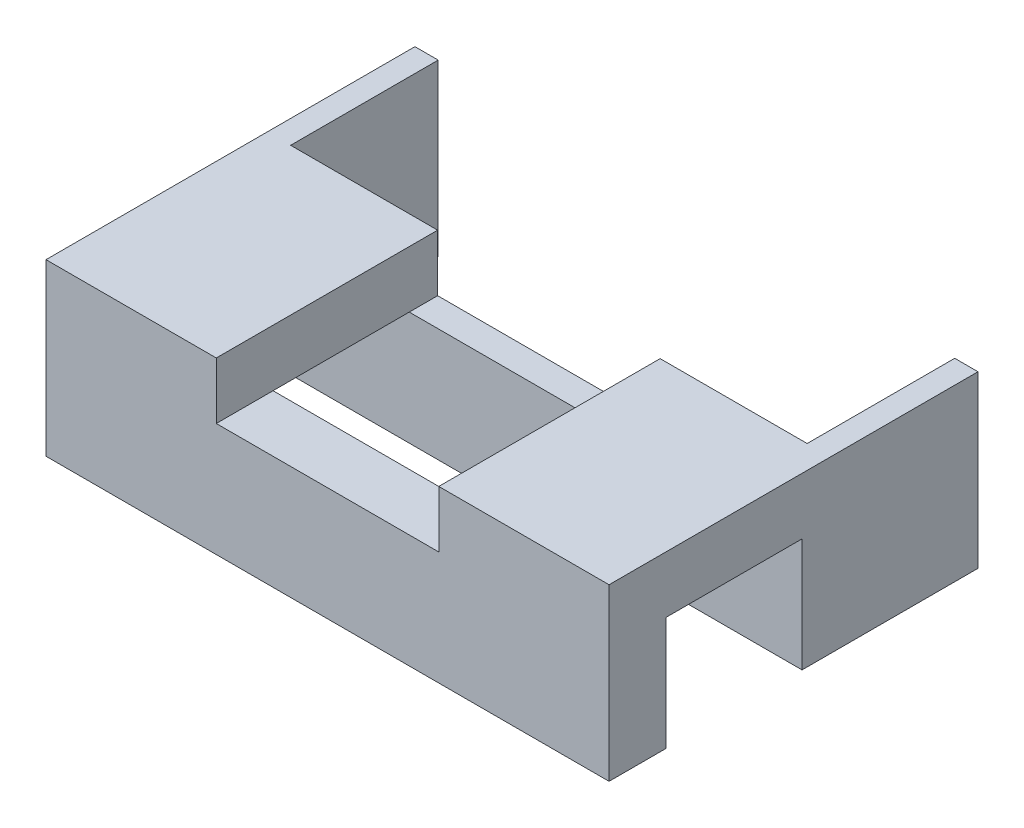
ISO-10303-21;
HEADER;
FILE_DESCRIPTION(('STEP AP214'),'2;1');
FILE_NAME('part.step','',(''),(''),'','','');
FILE_SCHEMA(('AUTOMOTIVE_DESIGN { 1 0 10303 214 1 1 1 1 }'));
ENDSEC;
DATA;
#1=APPLICATION_CONTEXT('core data for automotive mechanical design processes');
#2=APPLICATION_PROTOCOL_DEFINITION('international standard','automotive_design',2000,#1);
#3=PRODUCT_CONTEXT('',#1,'mechanical');
#4=PRODUCT('Part','Part','',(#3));
#5=PRODUCT_RELATED_PRODUCT_CATEGORY('part','',(#4));
#6=PRODUCT_DEFINITION_FORMATION('','',#4);
#7=PRODUCT_DEFINITION_CONTEXT('part definition',#1,'design');
#8=PRODUCT_DEFINITION('design','',#6,#7);
#9=PRODUCT_DEFINITION_SHAPE('','',#8);
#10=(LENGTH_UNIT() NAMED_UNIT(*) SI_UNIT(.MILLI.,.METRE.));
#11=(NAMED_UNIT(*) PLANE_ANGLE_UNIT() SI_UNIT($,.RADIAN.));
#12=(NAMED_UNIT(*) SI_UNIT($,.STERADIAN.) SOLID_ANGLE_UNIT());
#13=UNCERTAINTY_MEASURE_WITH_UNIT(LENGTH_MEASURE(1.E-05),#10,'distance_accuracy_value','');
#14=(GEOMETRIC_REPRESENTATION_CONTEXT(3) GLOBAL_UNCERTAINTY_ASSIGNED_CONTEXT((#13)) GLOBAL_UNIT_ASSIGNED_CONTEXT((#10,
#11,#12)) REPRESENTATION_CONTEXT('',''));
#15=CARTESIAN_POINT('',(0.,0.,0.));
#16=DIRECTION('',(0.,0.,1.));
#17=DIRECTION('',(1.,0.,0.));
#18=AXIS2_PLACEMENT_3D('',#15,#16,#17);
#19=CARTESIAN_POINT('',(24.8,0.,-40.));
#20=DIRECTION('',(-1.,0.,0.));
#21=DIRECTION('',(0.,0.,1.));
#22=AXIS2_PLACEMENT_3D('',#19,#20,#21);
#23=PLANE('',#22);
#24=DIRECTION('',(0.,0.,-1.));
#25=VECTOR('',#24,1.);
#26=CARTESIAN_POINT('',(24.8,9.99999999999999,-40.));
#27=LINE('',#26,#25);
#28=CARTESIAN_POINT('',(24.8,9.99999999999999,-24.5));
#29=VERTEX_POINT('',#28);
#30=CARTESIAN_POINT('',(24.8,9.99999999999999,-40.));
#31=VERTEX_POINT('',#30);
#32=EDGE_CURVE('E101',#29,#31,#27,.T.);
#33=ORIENTED_EDGE('',*,*,#32,.T.);
#34=DIRECTION('',(0.,1.,0.));
#35=VECTOR('',#34,1.);
#36=CARTESIAN_POINT('',(24.8,0.,-40.));
#37=LINE('',#36,#35);
#38=CARTESIAN_POINT('',(24.8,25.,-40.));
#39=VERTEX_POINT('',#38);
#40=EDGE_CURVE('E107',#31,#39,#37,.T.);
#41=ORIENTED_EDGE('',*,*,#40,.T.);
#42=DIRECTION('',(0.,0.,-1.));
#43=VECTOR('',#42,1.);
#44=CARTESIAN_POINT('',(24.8,25.,-29.5));
#45=LINE('',#44,#43);
#46=CARTESIAN_POINT('',(24.8,25.,-7.49999999999999));
#47=VERTEX_POINT('',#46);
#48=EDGE_CURVE('E106',#47,#39,#45,.T.);
#49=ORIENTED_EDGE('',*,*,#48,.F.);
#50=DIRECTION('',(0.,-1.,0.));
#51=VECTOR('',#50,1.);
#52=CARTESIAN_POINT('',(24.8,20.,-7.49999999999999));
#53=LINE('',#52,#51);
#54=CARTESIAN_POINT('',(24.8,9.99999999999999,-7.49999999999999));
#55=VERTEX_POINT('',#54);
#56=EDGE_CURVE('E85',#47,#55,#53,.T.);
#57=ORIENTED_EDGE('',*,*,#56,.T.);
#58=CARTESIAN_POINT('',(24.8,9.99999999999999,-12.5));
#59=VERTEX_POINT('',#58);
#60=EDGE_CURVE('E96',#55,#59,#27,.T.);
#61=ORIENTED_EDGE('',*,*,#60,.T.);
#62=DIRECTION('',(0.,-1.,0.));
#63=VECTOR('',#62,1.);
#64=CARTESIAN_POINT('',(24.8,20.,-12.5));
#65=LINE('',#64,#63);
#66=CARTESIAN_POINT('',(24.8,20.,-12.5));
#67=VERTEX_POINT('',#66);
#68=EDGE_CURVE('E112',#67,#59,#65,.T.);
#69=ORIENTED_EDGE('',*,*,#68,.F.);
#70=DIRECTION('',(0.,0.,-1.));
#71=VECTOR('',#70,1.);
#72=CARTESIAN_POINT('',(24.8,20.,-29.5));
#73=LINE('',#72,#71);
#74=CARTESIAN_POINT('',(24.8,20.,-24.5));
#75=VERTEX_POINT('',#74);
#76=EDGE_CURVE('E100',#67,#75,#73,.T.);
#77=ORIENTED_EDGE('',*,*,#76,.T.);
#78=DIRECTION('',(0.,-1.,0.));
#79=VECTOR('',#78,1.);
#80=CARTESIAN_POINT('',(24.8,20.,-24.5));
#81=LINE('',#80,#79);
#82=EDGE_CURVE('E154',#75,#29,#81,.T.);
#83=ORIENTED_EDGE('',*,*,#82,.T.);
#84=EDGE_LOOP('',(#33,#41,#49,#57,#61,#69,#77,#83));
#85=FACE_BOUND('',#84,.T.);
#86=ADVANCED_FACE('F36',(#85),#23,.F.);
#87=CARTESIAN_POINT('',(-24.8,0.,-40.));
#88=DIRECTION('',(1.,0.,0.));
#89=DIRECTION('',(0.,0.,-1.));
#90=AXIS2_PLACEMENT_3D('',#87,#88,#89);
#91=PLANE('',#90);
#92=DIRECTION('',(0.,0.,1.));
#93=VECTOR('',#92,1.);
#94=CARTESIAN_POINT('',(-24.8,9.99999999999999,3.00000000000001));
#95=LINE('',#94,#93);
#96=CARTESIAN_POINT('',(-24.8,9.99999999999999,-12.5));
#97=VERTEX_POINT('',#96);
#98=CARTESIAN_POINT('',(-24.8,9.99999999999999,-7.49999999999999));
#99=VERTEX_POINT('',#98);
#100=EDGE_CURVE('E206',#97,#99,#95,.T.);
#101=ORIENTED_EDGE('',*,*,#100,.T.);
#102=DIRECTION('',(0.,-1.,0.));
#103=VECTOR('',#102,1.);
#104=CARTESIAN_POINT('',(-24.8,20.,-7.49999999999999));
#105=LINE('',#104,#103);
#106=CARTESIAN_POINT('',(-24.8,25.,-7.49999999999999));
#107=VERTEX_POINT('',#106);
#108=EDGE_CURVE('E89',#107,#99,#105,.T.);
#109=ORIENTED_EDGE('',*,*,#108,.F.);
#110=DIRECTION('',(0.,0.,1.));
#111=VECTOR('',#110,1.);
#112=CARTESIAN_POINT('',(-24.8,25.,-29.5));
#113=LINE('',#112,#111);
#114=CARTESIAN_POINT('',(-24.8,25.,-40.));
#115=VERTEX_POINT('',#114);
#116=EDGE_CURVE('E136',#115,#107,#113,.T.);
#117=ORIENTED_EDGE('',*,*,#116,.F.);
#118=DIRECTION('',(0.,1.,0.));
#119=VECTOR('',#118,1.);
#120=CARTESIAN_POINT('',(-24.8,0.,-40.));
#121=LINE('',#120,#119);
#122=CARTESIAN_POINT('',(-24.8,10.,-40.));
#123=VERTEX_POINT('',#122);
#124=EDGE_CURVE('E303',#123,#115,#121,.T.);
#125=ORIENTED_EDGE('',*,*,#124,.F.);
#126=CARTESIAN_POINT('',(-24.8,9.99999999999999,-24.5));
#127=VERTEX_POINT('',#126);
#128=EDGE_CURVE('E128',#123,#127,#95,.T.);
#129=ORIENTED_EDGE('',*,*,#128,.T.);
#130=DIRECTION('',(0.,-1.,0.));
#131=VECTOR('',#130,1.);
#132=CARTESIAN_POINT('',(-24.8,20.,-24.5));
#133=LINE('',#132,#131);
#134=CARTESIAN_POINT('',(-24.8,20.,-24.5));
#135=VERTEX_POINT('',#134);
#136=EDGE_CURVE('E93',#135,#127,#133,.T.);
#137=ORIENTED_EDGE('',*,*,#136,.F.);
#138=DIRECTION('',(0.,0.,1.));
#139=VECTOR('',#138,1.);
#140=CARTESIAN_POINT('',(-24.8,20.,-29.5));
#141=LINE('',#140,#139);
#142=CARTESIAN_POINT('',(-24.8,20.,-12.5));
#143=VERTEX_POINT('',#142);
#144=EDGE_CURVE('E124',#135,#143,#141,.T.);
#145=ORIENTED_EDGE('',*,*,#144,.T.);
#146=DIRECTION('',(0.,-1.,0.));
#147=VECTOR('',#146,1.);
#148=CARTESIAN_POINT('',(-24.8,20.,-12.5));
#149=LINE('',#148,#147);
#150=EDGE_CURVE('E127',#143,#97,#149,.T.);
#151=ORIENTED_EDGE('',*,*,#150,.T.);
#152=EDGE_LOOP('',(#101,#109,#117,#125,#129,#137,#145,#151));
#153=FACE_BOUND('',#152,.T.);
#154=ADVANCED_FACE('F321',(#153),#91,.F.);
#155=CARTESIAN_POINT('',(-22.75,2.5,-29.5));
#156=DIRECTION('',(-1.,0.,0.));
#157=DIRECTION('',(0.,0.,1.));
#158=AXIS2_PLACEMENT_3D('',#155,#156,#157);
#159=PLANE('',#158);
#160=DIRECTION('',(0.,0.,1.));
#161=VECTOR('',#160,1.);
#162=CARTESIAN_POINT('',(-22.75,10.,-29.5));
#163=LINE('',#162,#161);
#164=CARTESIAN_POINT('',(-22.75,9.99999999999999,-40.));
#165=VERTEX_POINT('',#164);
#166=CARTESIAN_POINT('',(-22.75,10.,-27.));
#167=VERTEX_POINT('',#166);
#168=EDGE_CURVE('E46',#165,#167,#163,.T.);
#169=ORIENTED_EDGE('',*,*,#168,.F.);
#170=DIRECTION('',(0.,1.,0.));
#171=VECTOR('',#170,1.);
#172=CARTESIAN_POINT('',(-22.75,2.5,-40.));
#173=LINE('',#172,#171);
#174=CARTESIAN_POINT('',(-22.75,25.,-40.));
#175=VERTEX_POINT('',#174);
#176=EDGE_CURVE('E166',#165,#175,#173,.T.);
#177=ORIENTED_EDGE('',*,*,#176,.T.);
#178=DIRECTION('',(0.,0.,-1.));
#179=VECTOR('',#178,1.);
#180=CARTESIAN_POINT('',(-22.75,25.,-29.5));
#181=LINE('',#180,#179);
#182=CARTESIAN_POINT('',(-22.75,25.,-27.));
#183=VERTEX_POINT('',#182);
#184=EDGE_CURVE('E172',#183,#175,#181,.T.);
#185=ORIENTED_EDGE('',*,*,#184,.F.);
#186=DIRECTION('',(0.,1.,0.));
#187=VECTOR('',#186,1.);
#188=CARTESIAN_POINT('',(-22.75,2.5,-27.));
#189=LINE('',#188,#187);
#190=EDGE_CURVE('E190',#167,#183,#189,.T.);
#191=ORIENTED_EDGE('',*,*,#190,.F.);
#192=EDGE_LOOP('',(#169,#177,#185,#191));
#193=FACE_BOUND('',#192,.T.);
#194=ADVANCED_FACE('F272',(#193),#159,.F.);
#195=CARTESIAN_POINT('',(22.75,2.5,-29.5));
#196=DIRECTION('',(1.,0.,0.));
#197=DIRECTION('',(0.,0.,-1.));
#198=AXIS2_PLACEMENT_3D('',#195,#196,#197);
#199=PLANE('',#198);
#200=DIRECTION('',(0.,0.,-1.));
#201=VECTOR('',#200,1.);
#202=CARTESIAN_POINT('',(22.75,10.,-29.5));
#203=LINE('',#202,#201);
#204=CARTESIAN_POINT('',(22.75,10.,-27.));
#205=VERTEX_POINT('',#204);
#206=CARTESIAN_POINT('',(22.75,10.,-40.));
#207=VERTEX_POINT('',#206);
#208=EDGE_CURVE('E11',#205,#207,#203,.T.);
#209=ORIENTED_EDGE('',*,*,#208,.F.);
#210=DIRECTION('',(0.,-1.,0.));
#211=VECTOR('',#210,1.);
#212=CARTESIAN_POINT('',(22.75,25.,-27.));
#213=LINE('',#212,#211);
#214=CARTESIAN_POINT('',(22.75,25.,-27.));
#215=VERTEX_POINT('',#214);
#216=EDGE_CURVE('E169',#215,#205,#213,.T.);
#217=ORIENTED_EDGE('',*,*,#216,.F.);
#218=DIRECTION('',(0.,0.,1.));
#219=VECTOR('',#218,1.);
#220=CARTESIAN_POINT('',(22.75,25.,-40.));
#221=LINE('',#220,#219);
#222=CARTESIAN_POINT('',(22.75,25.,-40.));
#223=VERTEX_POINT('',#222);
#224=EDGE_CURVE('E150',#223,#215,#221,.T.);
#225=ORIENTED_EDGE('',*,*,#224,.F.);
#226=DIRECTION('',(0.,1.,0.));
#227=VECTOR('',#226,1.);
#228=CARTESIAN_POINT('',(22.75,2.5,-40.));
#229=LINE('',#228,#227);
#230=EDGE_CURVE('E162',#207,#223,#229,.T.);
#231=ORIENTED_EDGE('',*,*,#230,.F.);
#232=EDGE_LOOP('',(#209,#217,#225,#231));
#233=FACE_BOUND('',#232,.T.);
#234=ADVANCED_FACE('F347',(#233),#199,.F.);
#235=CARTESIAN_POINT('',(0.,0.,-27.));
#236=DIRECTION('',(0.,0.,-1.));
#237=DIRECTION('',(-1.,0.,0.));
#238=AXIS2_PLACEMENT_3D('',#235,#236,#237);
#239=PLANE('',#238);
#240=ORIENTED_EDGE('',*,*,#216,.T.);
#241=DIRECTION('',(-1.,0.,0.));
#242=VECTOR('',#241,1.);
#243=CARTESIAN_POINT('',(0.,10.,-27.));
#244=LINE('',#243,#242);
#245=EDGE_CURVE('E193',#205,#167,#244,.T.);
#246=ORIENTED_EDGE('',*,*,#245,.T.);
#247=ORIENTED_EDGE('',*,*,#190,.T.);
#248=DIRECTION('',(1.,0.,0.));
#249=VECTOR('',#248,1.);
#250=CARTESIAN_POINT('',(-22.75,25.,-27.));
#251=LINE('',#250,#249);
#252=CARTESIAN_POINT('',(-9.80000000000001,25.,-27.));
#253=VERTEX_POINT('',#252);
#254=EDGE_CURVE('E187',#183,#253,#251,.T.);
#255=ORIENTED_EDGE('',*,*,#254,.T.);
#256=DIRECTION('',(0.,-1.,0.));
#257=VECTOR('',#256,1.);
#258=CARTESIAN_POINT('',(-9.80000000000001,25.,-27.));
#259=LINE('',#258,#257);
#260=CARTESIAN_POINT('',(-9.80000000000001,20.,-27.));
#261=VERTEX_POINT('',#260);
#262=EDGE_CURVE('E184',#253,#261,#259,.T.);
#263=ORIENTED_EDGE('',*,*,#262,.T.);
#264=DIRECTION('',(1.,0.,0.));
#265=VECTOR('',#264,1.);
#266=CARTESIAN_POINT('',(-9.80000000000001,20.,-27.));
#267=LINE('',#266,#265);
#268=CARTESIAN_POINT('',(9.80000000000002,20.,-27.));
#269=VERTEX_POINT('',#268);
#270=EDGE_CURVE('E180',#261,#269,#267,.T.);
#271=ORIENTED_EDGE('',*,*,#270,.T.);
#272=DIRECTION('',(0.,1.,0.));
#273=VECTOR('',#272,1.);
#274=CARTESIAN_POINT('',(9.80000000000002,20.,-27.));
#275=LINE('',#274,#273);
#276=CARTESIAN_POINT('',(9.80000000000002,25.,-27.));
#277=VERTEX_POINT('',#276);
#278=EDGE_CURVE('E183',#269,#277,#275,.T.);
#279=ORIENTED_EDGE('',*,*,#278,.T.);
#280=DIRECTION('',(1.,0.,0.));
#281=VECTOR('',#280,1.);
#282=CARTESIAN_POINT('',(9.80000000000002,25.,-27.));
#283=LINE('',#282,#281);
#284=EDGE_CURVE('E196',#277,#215,#283,.T.);
#285=ORIENTED_EDGE('',*,*,#284,.T.);
#286=EDGE_LOOP('',(#240,#246,#247,#255,#263,#271,#279,#285));
#287=FACE_BOUND('',#286,.T.);
#288=ADVANCED_FACE('F262',(#287),#239,.T.);
#289=CARTESIAN_POINT('',(45.,-146.026871105171,-40.));
#290=DIRECTION('',(0.,0.,-1.));
#291=DIRECTION('',(-1.,0.,0.));
#292=AXIS2_PLACEMENT_3D('',#289,#290,#291);
#293=PLANE('',#292);
#294=ORIENTED_EDGE('',*,*,#40,.F.);
#295=DIRECTION('',(-1.,0.,0.));
#296=VECTOR('',#295,1.);
#297=CARTESIAN_POINT('',(-24.8,9.99999999999999,-40.));
#298=LINE('',#297,#296);
#299=EDGE_CURVE('E40',#31,#207,#298,.T.);
#300=ORIENTED_EDGE('',*,*,#299,.T.);
#301=ORIENTED_EDGE('',*,*,#230,.T.);
#302=DIRECTION('',(-1.,0.,0.));
#303=VECTOR('',#302,1.);
#304=CARTESIAN_POINT('',(24.8,25.,-40.));
#305=LINE('',#304,#303);
#306=EDGE_CURVE('E145',#39,#223,#305,.T.);
#307=ORIENTED_EDGE('',*,*,#306,.F.);
#308=EDGE_LOOP('',(#294,#300,#301,#307));
#309=FACE_BOUND('',#308,.T.);
#310=ADVANCED_FACE('F218',(#309),#293,.T.);
#311=ORIENTED_EDGE('',*,*,#176,.F.);
#312=EDGE_CURVE('E165',#165,#123,#298,.T.);
#313=ORIENTED_EDGE('',*,*,#312,.T.);
#314=ORIENTED_EDGE('',*,*,#124,.T.);
#315=DIRECTION('',(-1.,0.,0.));
#316=VECTOR('',#315,1.);
#317=CARTESIAN_POINT('',(-22.75,25.,-40.));
#318=LINE('',#317,#316);
#319=EDGE_CURVE('E139',#175,#115,#318,.T.);
#320=ORIENTED_EDGE('',*,*,#319,.F.);
#321=EDGE_LOOP('',(#311,#313,#314,#320));
#322=FACE_BOUND('',#321,.T.);
#323=ADVANCED_FACE('F360',(#322),#293,.T.);
#324=CARTESIAN_POINT('',(0.,20.,0.));
#325=DIRECTION('',(0.,1.,0.));
#326=DIRECTION('',(0.,0.,1.));
#327=AXIS2_PLACEMENT_3D('',#324,#325,#326);
#328=PLANE('',#327);
#329=DIRECTION('',(0.,0.,1.));
#330=VECTOR('',#329,1.);
#331=CARTESIAN_POINT('',(9.80000000000002,20.,-29.5));
#332=LINE('',#331,#330);
#333=CARTESIAN_POINT('',(9.80000000000002,20.,-24.5));
#334=VERTEX_POINT('',#333);
#335=EDGE_CURVE('E155',#269,#334,#332,.T.);
#336=ORIENTED_EDGE('',*,*,#335,.F.);
#337=ORIENTED_EDGE('',*,*,#270,.F.);
#338=DIRECTION('',(0.,0.,-1.));
#339=VECTOR('',#338,1.);
#340=CARTESIAN_POINT('',(-9.80000000000001,20.,-29.5));
#341=LINE('',#340,#339);
#342=CARTESIAN_POINT('',(-9.80000000000001,20.,-24.5));
#343=VERTEX_POINT('',#342);
#344=EDGE_CURVE('E123',#343,#261,#341,.T.);
#345=ORIENTED_EDGE('',*,*,#344,.F.);
#346=DIRECTION('',(1.,0.,0.));
#347=VECTOR('',#346,1.);
#348=CARTESIAN_POINT('',(-24.8,20.,-24.5));
#349=LINE('',#348,#347);
#350=EDGE_CURVE('E119',#343,#334,#349,.T.);
#351=ORIENTED_EDGE('',*,*,#350,.T.);
#352=EDGE_LOOP('',(#336,#337,#345,#351));
#353=FACE_BOUND('',#352,.T.);
#354=ADVANCED_FACE('F290',(#353),#328,.T.);
#355=CARTESIAN_POINT('',(-9.80000000000001,25.,-29.5));
#356=DIRECTION('',(-1.,0.,0.));
#357=DIRECTION('',(0.,0.,1.));
#358=AXIS2_PLACEMENT_3D('',#355,#356,#357);
#359=PLANE('',#358);
#360=ORIENTED_EDGE('',*,*,#262,.F.);
#361=DIRECTION('',(0.,0.,-1.));
#362=VECTOR('',#361,1.);
#363=CARTESIAN_POINT('',(-9.80000000000001,25.,-29.5));
#364=LINE('',#363,#362);
#365=CARTESIAN_POINT('',(-9.8,25.,-7.49999999999999));
#366=VERTEX_POINT('',#365);
#367=EDGE_CURVE('E129',#366,#253,#364,.T.);
#368=ORIENTED_EDGE('',*,*,#367,.F.);
#369=DIRECTION('',(0.,-1.,0.));
#370=VECTOR('',#369,1.);
#371=CARTESIAN_POINT('',(-9.8,25.,-7.49999999999999));
#372=LINE('',#371,#370);
#373=CARTESIAN_POINT('',(-9.8,20.,-7.49999999999999));
#374=VERTEX_POINT('',#373);
#375=EDGE_CURVE('E115',#366,#374,#372,.T.);
#376=ORIENTED_EDGE('',*,*,#375,.T.);
#377=CARTESIAN_POINT('',(-9.8,20.,-12.5));
#378=VERTEX_POINT('',#377);
#379=EDGE_CURVE('E118',#374,#378,#341,.T.);
#380=ORIENTED_EDGE('',*,*,#379,.T.);
#381=EDGE_CURVE('E122',#378,#343,#341,.T.);
#382=ORIENTED_EDGE('',*,*,#381,.T.);
#383=ORIENTED_EDGE('',*,*,#344,.T.);
#384=EDGE_LOOP('',(#360,#368,#376,#380,#382,#383));
#385=FACE_BOUND('',#384,.T.);
#386=ADVANCED_FACE('F282',(#385),#359,.F.);
#387=CARTESIAN_POINT('',(9.80000000000002,25.,-29.5));
#388=DIRECTION('',(1.,0.,0.));
#389=DIRECTION('',(0.,0.,-1.));
#390=AXIS2_PLACEMENT_3D('',#387,#388,#389);
#391=PLANE('',#390);
#392=ORIENTED_EDGE('',*,*,#278,.F.);
#393=ORIENTED_EDGE('',*,*,#335,.T.);
#394=CARTESIAN_POINT('',(9.80000000000002,20.,-12.5));
#395=VERTEX_POINT('',#394);
#396=EDGE_CURVE('E158',#334,#395,#332,.T.);
#397=ORIENTED_EDGE('',*,*,#396,.T.);
#398=CARTESIAN_POINT('',(9.80000000000002,20.,-7.49999999999999));
#399=VERTEX_POINT('',#398);
#400=EDGE_CURVE('E159',#395,#399,#332,.T.);
#401=ORIENTED_EDGE('',*,*,#400,.T.);
#402=DIRECTION('',(0.,-1.,0.));
#403=VECTOR('',#402,1.);
#404=CARTESIAN_POINT('',(9.80000000000002,25.,-7.49999999999999));
#405=LINE('',#404,#403);
#406=CARTESIAN_POINT('',(9.80000000000002,25.,-7.49999999999999));
#407=VERTEX_POINT('',#406);
#408=EDGE_CURVE('E92',#407,#399,#405,.T.);
#409=ORIENTED_EDGE('',*,*,#408,.F.);
#410=DIRECTION('',(0.,0.,1.));
#411=VECTOR('',#410,1.);
#412=CARTESIAN_POINT('',(9.80000000000002,25.,-29.5));
#413=LINE('',#412,#411);
#414=EDGE_CURVE('E147',#277,#407,#413,.T.);
#415=ORIENTED_EDGE('',*,*,#414,.F.);
#416=EDGE_LOOP('',(#392,#393,#397,#401,#409,#415));
#417=FACE_BOUND('',#416,.T.);
#418=ADVANCED_FACE('F350',(#417),#391,.F.);
#419=CARTESIAN_POINT('',(0.,20.,0.));
#420=DIRECTION('',(0.,1.,0.));
#421=DIRECTION('',(0.,0.,1.));
#422=AXIS2_PLACEMENT_3D('',#419,#420,#421);
#423=PLANE('',#422);
#424=DIRECTION('',(1.,0.,0.));
#425=VECTOR('',#424,1.);
#426=CARTESIAN_POINT('',(-24.8,20.,-7.49999999999999));
#427=LINE('',#426,#425);
#428=EDGE_CURVE('E315',#374,#399,#427,.T.);
#429=ORIENTED_EDGE('',*,*,#428,.T.);
#430=ORIENTED_EDGE('',*,*,#400,.F.);
#431=DIRECTION('',(-1.,0.,0.));
#432=VECTOR('',#431,1.);
#433=CARTESIAN_POINT('',(-24.8,20.,-12.5));
#434=LINE('',#433,#432);
#435=EDGE_CURVE('E311',#395,#378,#434,.T.);
#436=ORIENTED_EDGE('',*,*,#435,.T.);
#437=ORIENTED_EDGE('',*,*,#379,.F.);
#438=EDGE_LOOP('',(#429,#430,#436,#437));
#439=FACE_BOUND('',#438,.T.);
#440=ADVANCED_FACE('F353',(#439),#423,.T.);
#441=CARTESIAN_POINT('',(-24.8,20.,-24.5));
#442=DIRECTION('',(0.,0.,-1.));
#443=DIRECTION('',(-1.,0.,0.));
#444=AXIS2_PLACEMENT_3D('',#441,#442,#443);
#445=PLANE('',#444);
#446=DIRECTION('',(1.,0.,0.));
#447=VECTOR('',#446,1.);
#448=CARTESIAN_POINT('',(-24.8,10.,-24.5));
#449=LINE('',#448,#447);
#450=EDGE_CURVE('E143',#127,#29,#449,.T.);
#451=ORIENTED_EDGE('',*,*,#450,.T.);
#452=ORIENTED_EDGE('',*,*,#82,.F.);
#453=DIRECTION('',(-1.,0.,0.));
#454=VECTOR('',#453,1.);
#455=CARTESIAN_POINT('',(-24.8,20.,-24.5));
#456=LINE('',#455,#454);
#457=EDGE_CURVE('E140',#75,#334,#456,.T.);
#458=ORIENTED_EDGE('',*,*,#457,.T.);
#459=ORIENTED_EDGE('',*,*,#350,.F.);
#460=EDGE_CURVE('E300',#135,#343,#349,.T.);
#461=ORIENTED_EDGE('',*,*,#460,.F.);
#462=ORIENTED_EDGE('',*,*,#136,.T.);
#463=EDGE_LOOP('',(#451,#452,#458,#459,#461,#462));
#464=FACE_BOUND('',#463,.T.);
#465=ADVANCED_FACE('F298',(#464),#445,.F.);
#466=CARTESIAN_POINT('',(-24.8,20.,-7.49999999999999));
#467=DIRECTION('',(0.,0.,-1.));
#468=DIRECTION('',(-1.,0.,0.));
#469=AXIS2_PLACEMENT_3D('',#466,#467,#468);
#470=PLANE('',#469);
#471=DIRECTION('',(1.,0.,0.));
#472=VECTOR('',#471,1.);
#473=CARTESIAN_POINT('',(-24.8,10.,-7.49999999999999));
#474=LINE('',#473,#472);
#475=EDGE_CURVE('E79',#99,#55,#474,.T.);
#476=ORIENTED_EDGE('',*,*,#475,.T.);
#477=ORIENTED_EDGE('',*,*,#56,.F.);
#478=DIRECTION('',(1.,0.,0.));
#479=VECTOR('',#478,1.);
#480=CARTESIAN_POINT('',(24.8,25.,-7.49999999999999));
#481=LINE('',#480,#479);
#482=EDGE_CURVE('E146',#407,#47,#481,.T.);
#483=ORIENTED_EDGE('',*,*,#482,.F.);
#484=ORIENTED_EDGE('',*,*,#408,.T.);
#485=ORIENTED_EDGE('',*,*,#428,.F.);
#486=ORIENTED_EDGE('',*,*,#375,.F.);
#487=DIRECTION('',(1.,0.,0.));
#488=VECTOR('',#487,1.);
#489=CARTESIAN_POINT('',(-24.8,25.,-7.49999999999999));
#490=LINE('',#489,#488);
#491=EDGE_CURVE('E133',#107,#366,#490,.T.);
#492=ORIENTED_EDGE('',*,*,#491,.F.);
#493=ORIENTED_EDGE('',*,*,#108,.T.);
#494=EDGE_LOOP('',(#476,#477,#483,#484,#485,#486,#492,#493));
#495=FACE_BOUND('',#494,.T.);
#496=ADVANCED_FACE('F81',(#495),#470,.F.);
#497=CARTESIAN_POINT('',(-24.8,20.,-12.5));
#498=DIRECTION('',(0.,0.,1.));
#499=DIRECTION('',(1.,0.,0.));
#500=AXIS2_PLACEMENT_3D('',#497,#498,#499);
#501=PLANE('',#500);
#502=DIRECTION('',(-1.,0.,0.));
#503=VECTOR('',#502,1.);
#504=CARTESIAN_POINT('',(-24.8,10.,-12.5));
#505=LINE('',#504,#503);
#506=EDGE_CURVE('E55',#59,#97,#505,.T.);
#507=ORIENTED_EDGE('',*,*,#506,.T.);
#508=ORIENTED_EDGE('',*,*,#150,.F.);
#509=EDGE_CURVE('E175',#378,#143,#434,.T.);
#510=ORIENTED_EDGE('',*,*,#509,.F.);
#511=ORIENTED_EDGE('',*,*,#435,.F.);
#512=EDGE_CURVE('E132',#67,#395,#434,.T.);
#513=ORIENTED_EDGE('',*,*,#512,.F.);
#514=ORIENTED_EDGE('',*,*,#68,.T.);
#515=EDGE_LOOP('',(#507,#508,#510,#511,#513,#514));
#516=FACE_BOUND('',#515,.T.);
#517=ADVANCED_FACE('F324',(#516),#501,.F.);
#518=CARTESIAN_POINT('',(0.,20.,0.));
#519=DIRECTION('',(0.,1.,0.));
#520=DIRECTION('',(0.,0.,1.));
#521=AXIS2_PLACEMENT_3D('',#518,#519,#520);
#522=PLANE('',#521);
#523=ORIENTED_EDGE('',*,*,#144,.F.);
#524=ORIENTED_EDGE('',*,*,#460,.T.);
#525=ORIENTED_EDGE('',*,*,#381,.F.);
#526=ORIENTED_EDGE('',*,*,#509,.T.);
#527=EDGE_LOOP('',(#523,#524,#525,#526));
#528=FACE_BOUND('',#527,.T.);
#529=ADVANCED_FACE('F307',(#528),#522,.F.);
#530=CARTESIAN_POINT('',(0.,25.,0.));
#531=DIRECTION('',(0.,1.,0.));
#532=DIRECTION('',(0.,0.,1.));
#533=AXIS2_PLACEMENT_3D('',#530,#531,#532);
#534=PLANE('',#533);
#535=ORIENTED_EDGE('',*,*,#254,.F.);
#536=ORIENTED_EDGE('',*,*,#184,.T.);
#537=ORIENTED_EDGE('',*,*,#319,.T.);
#538=ORIENTED_EDGE('',*,*,#116,.T.);
#539=ORIENTED_EDGE('',*,*,#491,.T.);
#540=ORIENTED_EDGE('',*,*,#367,.T.);
#541=EDGE_LOOP('',(#535,#536,#537,#538,#539,#540));
#542=FACE_BOUND('',#541,.T.);
#543=ADVANCED_FACE('F276',(#542),#534,.T.);
#544=CARTESIAN_POINT('',(0.,20.,0.));
#545=DIRECTION('',(0.,-1.,0.));
#546=DIRECTION('',(0.,0.,-1.));
#547=AXIS2_PLACEMENT_3D('',#544,#545,#546);
#548=PLANE('',#547);
#549=ORIENTED_EDGE('',*,*,#457,.F.);
#550=ORIENTED_EDGE('',*,*,#76,.F.);
#551=ORIENTED_EDGE('',*,*,#512,.T.);
#552=ORIENTED_EDGE('',*,*,#396,.F.);
#553=EDGE_LOOP('',(#549,#550,#551,#552));
#554=FACE_BOUND('',#553,.T.);
#555=ADVANCED_FACE('F339',(#554),#548,.T.);
#556=CARTESIAN_POINT('',(0.,25.,0.));
#557=DIRECTION('',(0.,-1.,0.));
#558=DIRECTION('',(0.,0.,-1.));
#559=AXIS2_PLACEMENT_3D('',#556,#557,#558);
#560=PLANE('',#559);
#561=ORIENTED_EDGE('',*,*,#224,.T.);
#562=ORIENTED_EDGE('',*,*,#284,.F.);
#563=ORIENTED_EDGE('',*,*,#414,.T.);
#564=ORIENTED_EDGE('',*,*,#482,.T.);
#565=ORIENTED_EDGE('',*,*,#48,.T.);
#566=ORIENTED_EDGE('',*,*,#306,.T.);
#567=EDGE_LOOP('',(#561,#562,#563,#564,#565,#566));
#568=FACE_BOUND('',#567,.T.);
#569=ADVANCED_FACE('F225',(#568),#560,.F.);
#570=CARTESIAN_POINT('',(-35.,10.,-35.));
#571=DIRECTION('',(0.,-1.,0.));
#572=DIRECTION('',(0.,0.,-1.));
#573=AXIS2_PLACEMENT_3D('',#570,#571,#572);
#574=PLANE('',#573);
#575=ORIENTED_EDGE('',*,*,#32,.F.);
#576=ORIENTED_EDGE('',*,*,#450,.F.);
#577=ORIENTED_EDGE('',*,*,#128,.F.);
#578=ORIENTED_EDGE('',*,*,#312,.F.);
#579=ORIENTED_EDGE('',*,*,#168,.T.);
#580=ORIENTED_EDGE('',*,*,#245,.F.);
#581=ORIENTED_EDGE('',*,*,#208,.T.);
#582=ORIENTED_EDGE('',*,*,#299,.F.);
#583=EDGE_LOOP('',(#575,#576,#577,#578,#579,#580,#581,#582));
#584=FACE_BOUND('',#583,.T.);
#585=ADVANCED_FACE('F38',(#584),#574,.T.);
#586=ORIENTED_EDGE('',*,*,#60,.F.);
#587=ORIENTED_EDGE('',*,*,#475,.F.);
#588=ORIENTED_EDGE('',*,*,#100,.F.);
#589=ORIENTED_EDGE('',*,*,#506,.F.);
#590=EDGE_LOOP('',(#586,#587,#588,#589));
#591=FACE_BOUND('',#590,.T.);
#592=ADVANCED_FACE('F97',(#591),#574,.T.);
#593=CLOSED_SHELL('',(#86,#154,#194,#234,#288,#310,#323,#354,#386,#418,#440,#465,#496,#517,#529,
#543,#555,#569,#585,#592));
#594=MANIFOLD_SOLID_BREP('B2',#593);
#595=ADVANCED_BREP_SHAPE_REPRESENTATION('',(#18,#594),#14);
#596=SHAPE_DEFINITION_REPRESENTATION(#9,#595);
ENDSEC;
END-ISO-10303-21;
